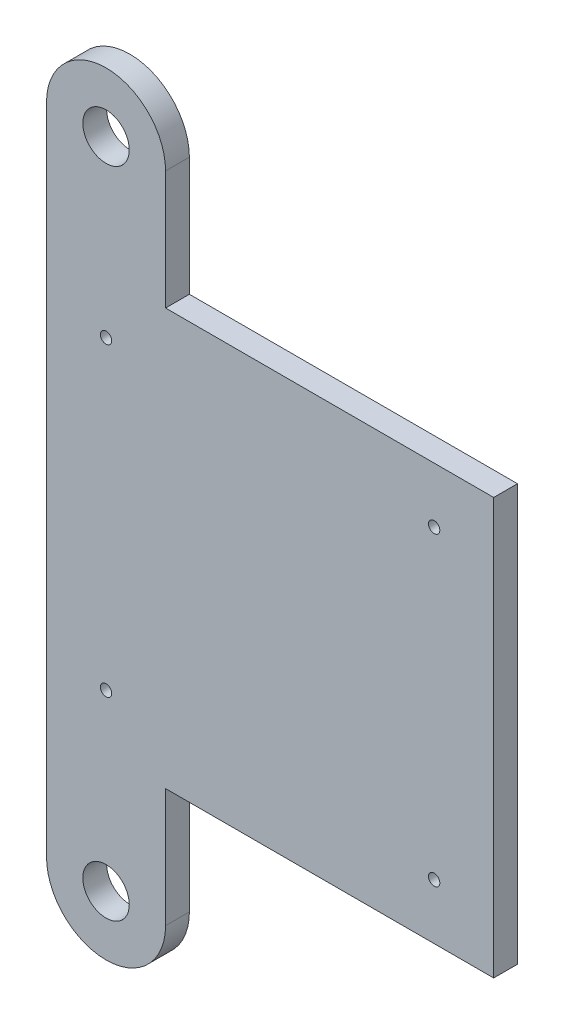
ISO-10303-21;
HEADER;
FILE_DESCRIPTION(('STEP AP214'),'2;1');
FILE_NAME('part.step','',(''),(''),'','','');
FILE_SCHEMA(('AUTOMOTIVE_DESIGN { 1 0 10303 214 1 1 1 1 }'));
ENDSEC;
DATA;
#1=APPLICATION_CONTEXT('core data for automotive mechanical design processes');
#2=APPLICATION_PROTOCOL_DEFINITION('international standard','automotive_design',2000,#1);
#3=PRODUCT_CONTEXT('',#1,'mechanical');
#4=PRODUCT('Part','Part','',(#3));
#5=PRODUCT_RELATED_PRODUCT_CATEGORY('part','',(#4));
#6=PRODUCT_DEFINITION_FORMATION('','',#4);
#7=PRODUCT_DEFINITION_CONTEXT('part definition',#1,'design');
#8=PRODUCT_DEFINITION('design','',#6,#7);
#9=PRODUCT_DEFINITION_SHAPE('','',#8);
#10=(LENGTH_UNIT() NAMED_UNIT(*) SI_UNIT(.MILLI.,.METRE.));
#11=(NAMED_UNIT(*) PLANE_ANGLE_UNIT() SI_UNIT($,.RADIAN.));
#12=(NAMED_UNIT(*) SI_UNIT($,.STERADIAN.) SOLID_ANGLE_UNIT());
#13=UNCERTAINTY_MEASURE_WITH_UNIT(LENGTH_MEASURE(1.E-05),#10,'distance_accuracy_value','');
#14=(GEOMETRIC_REPRESENTATION_CONTEXT(3) GLOBAL_UNCERTAINTY_ASSIGNED_CONTEXT((#13)) GLOBAL_UNIT_ASSIGNED_CONTEXT((#10,
#11,#12)) REPRESENTATION_CONTEXT('',''));
#15=CARTESIAN_POINT('',(0.,0.,0.));
#16=DIRECTION('',(0.,0.,1.));
#17=DIRECTION('',(1.,0.,0.));
#18=AXIS2_PLACEMENT_3D('',#15,#16,#17);
#19=CARTESIAN_POINT('',(0.,17.4784833091437,2.));
#20=DIRECTION('',(0.,1.,0.));
#21=DIRECTION('',(-1.,0.,0.));
#22=AXIS2_PLACEMENT_3D('',#19,#20,#21);
#23=PLANE('',#22);
#24=DIRECTION('',(1.,0.,0.));
#25=VECTOR('',#24,1.);
#26=CARTESIAN_POINT('',(0.,17.4784833091437,0.));
#27=LINE('',#26,#25);
#28=CARTESIAN_POINT('',(-8.77999999999999,17.4784833091437,0.));
#29=VERTEX_POINT('',#28);
#30=CARTESIAN_POINT('',(18.78,17.4784833091437,0.));
#31=VERTEX_POINT('',#30);
#32=EDGE_CURVE('E140',#29,#31,#27,.T.);
#33=ORIENTED_EDGE('',*,*,#32,.F.);
#34=DIRECTION('',(0.,0.,-1.));
#35=VECTOR('',#34,1.);
#36=CARTESIAN_POINT('',(-8.77999999999999,17.4784833091437,2.));
#37=LINE('',#36,#35);
#38=CARTESIAN_POINT('',(-8.77999999999999,17.4784833091437,2.));
#39=VERTEX_POINT('',#38);
#40=EDGE_CURVE('E11',#39,#29,#37,.T.);
#41=ORIENTED_EDGE('',*,*,#40,.F.);
#42=DIRECTION('',(1.,0.,0.));
#43=VECTOR('',#42,1.);
#44=CARTESIAN_POINT('',(0.,17.4784833091437,2.));
#45=LINE('',#44,#43);
#46=CARTESIAN_POINT('',(18.78,17.4784833091437,2.));
#47=VERTEX_POINT('',#46);
#48=EDGE_CURVE('E166',#39,#47,#45,.T.);
#49=ORIENTED_EDGE('',*,*,#48,.T.);
#50=DIRECTION('',(0.,0.,-1.));
#51=VECTOR('',#50,1.);
#52=CARTESIAN_POINT('',(18.78,17.4784833091437,2.));
#53=LINE('',#52,#51);
#54=EDGE_CURVE('E93',#47,#31,#53,.T.);
#55=ORIENTED_EDGE('',*,*,#54,.T.);
#56=EDGE_LOOP('',(#33,#41,#49,#55));
#57=FACE_BOUND('',#56,.T.);
#58=ADVANCED_FACE('F41',(#57),#23,.T.);
#59=CARTESIAN_POINT('',(-8.77999999999999,0.,2.));
#60=DIRECTION('',(-1.,0.,0.));
#61=DIRECTION('',(0.,-1.,0.));
#62=AXIS2_PLACEMENT_3D('',#59,#60,#61);
#63=PLANE('',#62);
#64=DIRECTION('',(0.,1.,0.));
#65=VECTOR('',#64,1.);
#66=CARTESIAN_POINT('',(-8.77999999999999,0.,0.));
#67=LINE('',#66,#65);
#68=CARTESIAN_POINT('',(-8.77999999999999,27.45,0.));
#69=VERTEX_POINT('',#68);
#70=EDGE_CURVE('E144',#29,#69,#67,.T.);
#71=ORIENTED_EDGE('',*,*,#70,.T.);
#72=DIRECTION('',(0.,0.,-1.));
#73=VECTOR('',#72,1.);
#74=CARTESIAN_POINT('',(-8.77999999999999,27.45,2.));
#75=LINE('',#74,#73);
#76=CARTESIAN_POINT('',(-8.77999999999999,27.45,2.));
#77=VERTEX_POINT('',#76);
#78=EDGE_CURVE('E50',#77,#69,#75,.T.);
#79=ORIENTED_EDGE('',*,*,#78,.F.);
#80=DIRECTION('',(0.,1.,0.));
#81=VECTOR('',#80,1.);
#82=CARTESIAN_POINT('',(-8.77999999999999,0.,2.));
#83=LINE('',#82,#81);
#84=EDGE_CURVE('E201',#39,#77,#83,.T.);
#85=ORIENTED_EDGE('',*,*,#84,.F.);
#86=ORIENTED_EDGE('',*,*,#40,.T.);
#87=EDGE_LOOP('',(#71,#79,#85,#86));
#88=FACE_BOUND('',#87,.T.);
#89=ADVANCED_FACE('F288',(#88),#63,.F.);
#90=CARTESIAN_POINT('',(-13.78,27.45,2.));
#91=DIRECTION('',(0.,0.,-1.));
#92=DIRECTION('',(-1.,0.,0.));
#93=AXIS2_PLACEMENT_3D('',#90,#91,#92);
#94=CYLINDRICAL_SURFACE('',#93,5.00000000000001);
#95=CARTESIAN_POINT('',(-13.78,27.45,0.));
#96=DIRECTION('',(0.,0.,1.));
#97=DIRECTION('',(1.,0.,0.));
#98=AXIS2_PLACEMENT_3D('',#95,#96,#97);
#99=CIRCLE('',#98,5.00000000000001);
#100=CARTESIAN_POINT('',(-18.78,27.45,0.));
#101=VERTEX_POINT('',#100);
#102=EDGE_CURVE('E148',#69,#101,#99,.T.);
#103=ORIENTED_EDGE('',*,*,#102,.T.);
#104=DIRECTION('',(0.,0.,-1.));
#105=VECTOR('',#104,1.);
#106=CARTESIAN_POINT('',(-18.78,27.45,2.));
#107=LINE('',#106,#105);
#108=CARTESIAN_POINT('',(-18.78,27.45,2.));
#109=VERTEX_POINT('',#108);
#110=EDGE_CURVE('E176',#109,#101,#107,.T.);
#111=ORIENTED_EDGE('',*,*,#110,.F.);
#112=CARTESIAN_POINT('',(-13.78,27.45,2.));
#113=DIRECTION('',(0.,0.,1.));
#114=DIRECTION('',(1.,0.,0.));
#115=AXIS2_PLACEMENT_3D('',#112,#113,#114);
#116=CIRCLE('',#115,5.00000000000001);
#117=EDGE_CURVE('E186',#77,#109,#116,.T.);
#118=ORIENTED_EDGE('',*,*,#117,.F.);
#119=ORIENTED_EDGE('',*,*,#78,.T.);
#120=EDGE_LOOP('',(#103,#111,#118,#119));
#121=FACE_BOUND('',#120,.T.);
#122=ADVANCED_FACE('F184',(#121),#94,.T.);
#123=CARTESIAN_POINT('',(-18.78,0.,2.));
#124=DIRECTION('',(-1.,0.,0.));
#125=DIRECTION('',(0.,0.,1.));
#126=AXIS2_PLACEMENT_3D('',#123,#124,#125);
#127=PLANE('',#126);
#128=DIRECTION('',(0.,1.,0.));
#129=VECTOR('',#128,1.);
#130=CARTESIAN_POINT('',(-18.78,0.,0.));
#131=LINE('',#130,#129);
#132=CARTESIAN_POINT('',(-18.78,-27.45,0.));
#133=VERTEX_POINT('',#132);
#134=EDGE_CURVE('E152',#133,#101,#131,.T.);
#135=ORIENTED_EDGE('',*,*,#134,.F.);
#136=DIRECTION('',(0.,0.,-1.));
#137=VECTOR('',#136,1.);
#138=CARTESIAN_POINT('',(-18.78,-27.45,2.));
#139=LINE('',#138,#137);
#140=CARTESIAN_POINT('',(-18.78,-27.45,2.));
#141=VERTEX_POINT('',#140);
#142=EDGE_CURVE('E173',#141,#133,#139,.T.);
#143=ORIENTED_EDGE('',*,*,#142,.F.);
#144=DIRECTION('',(0.,1.,0.));
#145=VECTOR('',#144,1.);
#146=CARTESIAN_POINT('',(-18.78,0.,2.));
#147=LINE('',#146,#145);
#148=EDGE_CURVE('E196',#141,#109,#147,.T.);
#149=ORIENTED_EDGE('',*,*,#148,.T.);
#150=ORIENTED_EDGE('',*,*,#110,.T.);
#151=EDGE_LOOP('',(#135,#143,#149,#150));
#152=FACE_BOUND('',#151,.T.);
#153=ADVANCED_FACE('F194',(#152),#127,.T.);
#154=CARTESIAN_POINT('',(-13.78,-27.45,2.));
#155=DIRECTION('',(0.,0.,-1.));
#156=DIRECTION('',(-1.,0.,0.));
#157=AXIS2_PLACEMENT_3D('',#154,#155,#156);
#158=CYLINDRICAL_SURFACE('',#157,5.00000000000001);
#159=CARTESIAN_POINT('',(-13.78,-27.45,0.));
#160=DIRECTION('',(0.,0.,1.));
#161=DIRECTION('',(1.,0.,0.));
#162=AXIS2_PLACEMENT_3D('',#159,#160,#161);
#163=CIRCLE('',#162,5.00000000000001);
#164=CARTESIAN_POINT('',(-8.77999999999999,-27.45,0.));
#165=VERTEX_POINT('',#164);
#166=EDGE_CURVE('E156',#133,#165,#163,.T.);
#167=ORIENTED_EDGE('',*,*,#166,.T.);
#168=DIRECTION('',(0.,0.,-1.));
#169=VECTOR('',#168,1.);
#170=CARTESIAN_POINT('',(-8.77999999999999,-27.45,2.));
#171=LINE('',#170,#169);
#172=CARTESIAN_POINT('',(-8.77999999999999,-27.45,2.));
#173=VERTEX_POINT('',#172);
#174=EDGE_CURVE('E130',#173,#165,#171,.T.);
#175=ORIENTED_EDGE('',*,*,#174,.F.);
#176=CARTESIAN_POINT('',(-13.78,-27.45,2.));
#177=DIRECTION('',(0.,0.,1.));
#178=DIRECTION('',(1.,0.,0.));
#179=AXIS2_PLACEMENT_3D('',#176,#177,#178);
#180=CIRCLE('',#179,5.00000000000001);
#181=EDGE_CURVE('E119',#141,#173,#180,.T.);
#182=ORIENTED_EDGE('',*,*,#181,.F.);
#183=ORIENTED_EDGE('',*,*,#142,.T.);
#184=EDGE_LOOP('',(#167,#175,#182,#183));
#185=FACE_BOUND('',#184,.T.);
#186=ADVANCED_FACE('F303',(#185),#158,.T.);
#187=CARTESIAN_POINT('',(-8.77999999999999,0.,2.));
#188=DIRECTION('',(-1.,0.,0.));
#189=DIRECTION('',(0.,-1.,0.));
#190=AXIS2_PLACEMENT_3D('',#187,#188,#189);
#191=PLANE('',#190);
#192=DIRECTION('',(0.,1.,0.));
#193=VECTOR('',#192,1.);
#194=CARTESIAN_POINT('',(-8.77999999999999,0.,0.));
#195=LINE('',#194,#193);
#196=CARTESIAN_POINT('',(-8.77999999999999,-17.4784833091437,0.));
#197=VERTEX_POINT('',#196);
#198=EDGE_CURVE('E128',#165,#197,#195,.T.);
#199=ORIENTED_EDGE('',*,*,#198,.T.);
#200=DIRECTION('',(0.,0.,-1.));
#201=VECTOR('',#200,1.);
#202=CARTESIAN_POINT('',(-8.77999999999999,-17.4784833091437,2.));
#203=LINE('',#202,#201);
#204=CARTESIAN_POINT('',(-8.77999999999999,-17.4784833091437,2.));
#205=VERTEX_POINT('',#204);
#206=EDGE_CURVE('E125',#205,#197,#203,.T.);
#207=ORIENTED_EDGE('',*,*,#206,.F.);
#208=DIRECTION('',(0.,1.,0.));
#209=VECTOR('',#208,1.);
#210=CARTESIAN_POINT('',(-8.77999999999999,0.,2.));
#211=LINE('',#210,#209);
#212=EDGE_CURVE('E112',#173,#205,#211,.T.);
#213=ORIENTED_EDGE('',*,*,#212,.F.);
#214=ORIENTED_EDGE('',*,*,#174,.T.);
#215=EDGE_LOOP('',(#199,#207,#213,#214));
#216=FACE_BOUND('',#215,.T.);
#217=ADVANCED_FACE('F126',(#216),#191,.F.);
#218=CARTESIAN_POINT('',(0.,-17.4784833091437,2.));
#219=DIRECTION('',(0.,1.,0.));
#220=DIRECTION('',(-1.,0.,0.));
#221=AXIS2_PLACEMENT_3D('',#218,#219,#220);
#222=PLANE('',#221);
#223=DIRECTION('',(1.,0.,0.));
#224=VECTOR('',#223,1.);
#225=CARTESIAN_POINT('',(0.,-17.4784833091437,0.));
#226=LINE('',#225,#224);
#227=CARTESIAN_POINT('',(18.78,-17.4784833091437,0.));
#228=VERTEX_POINT('',#227);
#229=EDGE_CURVE('E86',#197,#228,#226,.T.);
#230=ORIENTED_EDGE('',*,*,#229,.T.);
#231=DIRECTION('',(0.,0.,-1.));
#232=VECTOR('',#231,1.);
#233=CARTESIAN_POINT('',(18.78,-17.4784833091437,2.));
#234=LINE('',#233,#232);
#235=CARTESIAN_POINT('',(18.78,-17.4784833091437,2.));
#236=VERTEX_POINT('',#235);
#237=EDGE_CURVE('E131',#236,#228,#234,.T.);
#238=ORIENTED_EDGE('',*,*,#237,.F.);
#239=DIRECTION('',(1.,0.,0.));
#240=VECTOR('',#239,1.);
#241=CARTESIAN_POINT('',(0.,-17.4784833091437,2.));
#242=LINE('',#241,#240);
#243=EDGE_CURVE('E116',#205,#236,#242,.T.);
#244=ORIENTED_EDGE('',*,*,#243,.F.);
#245=ORIENTED_EDGE('',*,*,#206,.T.);
#246=EDGE_LOOP('',(#230,#238,#244,#245));
#247=FACE_BOUND('',#246,.T.);
#248=ADVANCED_FACE('F133',(#247),#222,.F.);
#249=CARTESIAN_POINT('',(18.78,0.,2.));
#250=DIRECTION('',(-1.,0.,0.));
#251=DIRECTION('',(0.,-1.,0.));
#252=AXIS2_PLACEMENT_3D('',#249,#250,#251);
#253=PLANE('',#252);
#254=DIRECTION('',(0.,1.,0.));
#255=VECTOR('',#254,1.);
#256=CARTESIAN_POINT('',(18.78,0.,0.));
#257=LINE('',#256,#255);
#258=EDGE_CURVE('E163',#228,#31,#257,.T.);
#259=ORIENTED_EDGE('',*,*,#258,.T.);
#260=ORIENTED_EDGE('',*,*,#54,.F.);
#261=DIRECTION('',(0.,1.,0.));
#262=VECTOR('',#261,1.);
#263=CARTESIAN_POINT('',(18.78,0.,2.));
#264=LINE('',#263,#262);
#265=EDGE_CURVE('E58',#236,#47,#264,.T.);
#266=ORIENTED_EDGE('',*,*,#265,.F.);
#267=ORIENTED_EDGE('',*,*,#237,.T.);
#268=EDGE_LOOP('',(#259,#260,#266,#267));
#269=FACE_BOUND('',#268,.T.);
#270=ADVANCED_FACE('F260',(#269),#253,.F.);
#271=CARTESIAN_POINT('',(0.,0.,2.));
#272=DIRECTION('',(0.,0.,1.));
#273=DIRECTION('',(1.,0.,0.));
#274=AXIS2_PLACEMENT_3D('',#271,#272,#273);
#275=PLANE('',#274);
#276=CARTESIAN_POINT('',(-13.78,-27.45,2.));
#277=DIRECTION('',(0.,0.,1.));
#278=DIRECTION('',(1.,0.,0.));
#279=AXIS2_PLACEMENT_3D('',#276,#277,#278);
#280=CIRCLE('',#279,1.95);
#281=CARTESIAN_POINT('',(-11.83,-27.45,2.));
#282=VERTEX_POINT('',#281);
#283=EDGE_CURVE('E251',#282,#282,#280,.T.);
#284=ORIENTED_EDGE('',*,*,#283,.F.);
#285=EDGE_LOOP('',(#284));
#286=FACE_BOUND('',#285,.T.);
#287=CARTESIAN_POINT('',(-13.78,27.45,2.));
#288=DIRECTION('',(0.,0.,1.));
#289=DIRECTION('',(1.,0.,0.));
#290=AXIS2_PLACEMENT_3D('',#287,#288,#289);
#291=CIRCLE('',#290,1.95);
#292=CARTESIAN_POINT('',(-11.83,27.45,2.));
#293=VERTEX_POINT('',#292);
#294=EDGE_CURVE('E243',#293,#293,#291,.T.);
#295=ORIENTED_EDGE('',*,*,#294,.F.);
#296=EDGE_LOOP('',(#295));
#297=FACE_BOUND('',#296,.T.);
#298=CARTESIAN_POINT('',(-13.78,-12.825,2.));
#299=DIRECTION('',(0.,0.,1.));
#300=DIRECTION('',(1.,0.,0.));
#301=AXIS2_PLACEMENT_3D('',#298,#299,#300);
#302=CIRCLE('',#301,0.474999999999988);
#303=CARTESIAN_POINT('',(-13.305,-12.825,2.));
#304=VERTEX_POINT('',#303);
#305=EDGE_CURVE('E235',#304,#304,#302,.T.);
#306=ORIENTED_EDGE('',*,*,#305,.F.);
#307=EDGE_LOOP('',(#306));
#308=FACE_BOUND('',#307,.T.);
#309=CARTESIAN_POINT('',(-13.78,12.825,2.));
#310=DIRECTION('',(0.,0.,1.));
#311=DIRECTION('',(1.,0.,0.));
#312=AXIS2_PLACEMENT_3D('',#309,#310,#311);
#313=CIRCLE('',#312,0.474999999999988);
#314=CARTESIAN_POINT('',(-13.305,12.825,2.));
#315=VERTEX_POINT('',#314);
#316=EDGE_CURVE('E227',#315,#315,#313,.T.);
#317=ORIENTED_EDGE('',*,*,#316,.F.);
#318=EDGE_LOOP('',(#317));
#319=FACE_BOUND('',#318,.T.);
#320=CARTESIAN_POINT('',(13.78,12.825,2.));
#321=DIRECTION('',(0.,0.,1.));
#322=DIRECTION('',(1.,0.,0.));
#323=AXIS2_PLACEMENT_3D('',#320,#321,#322);
#324=CIRCLE('',#323,0.474999999999988);
#325=CARTESIAN_POINT('',(14.255,12.825,2.));
#326=VERTEX_POINT('',#325);
#327=EDGE_CURVE('E219',#326,#326,#324,.T.);
#328=ORIENTED_EDGE('',*,*,#327,.F.);
#329=EDGE_LOOP('',(#328));
#330=FACE_BOUND('',#329,.T.);
#331=CARTESIAN_POINT('',(13.78,-12.825,2.));
#332=DIRECTION('',(0.,0.,1.));
#333=DIRECTION('',(1.,0.,0.));
#334=AXIS2_PLACEMENT_3D('',#331,#332,#333);
#335=CIRCLE('',#334,0.474999999999988);
#336=CARTESIAN_POINT('',(14.255,-12.825,2.));
#337=VERTEX_POINT('',#336);
#338=EDGE_CURVE('E211',#337,#337,#335,.T.);
#339=ORIENTED_EDGE('',*,*,#338,.F.);
#340=EDGE_LOOP('',(#339));
#341=FACE_BOUND('',#340,.T.);
#342=ORIENTED_EDGE('',*,*,#48,.F.);
#343=ORIENTED_EDGE('',*,*,#84,.T.);
#344=ORIENTED_EDGE('',*,*,#117,.T.);
#345=ORIENTED_EDGE('',*,*,#148,.F.);
#346=ORIENTED_EDGE('',*,*,#181,.T.);
#347=ORIENTED_EDGE('',*,*,#212,.T.);
#348=ORIENTED_EDGE('',*,*,#243,.T.);
#349=ORIENTED_EDGE('',*,*,#265,.T.);
#350=EDGE_LOOP('',(#342,#343,#344,#345,#346,#347,#348,#349));
#351=FACE_BOUND('',#350,.T.);
#352=ADVANCED_FACE('F114',(#286,#297,#308,#319,#330,#341,#351),#275,.T.);
#353=CARTESIAN_POINT('',(0.,0.,0.));
#354=DIRECTION('',(0.,0.,1.));
#355=DIRECTION('',(1.,0.,0.));
#356=AXIS2_PLACEMENT_3D('',#353,#354,#355);
#357=PLANE('',#356);
#358=CARTESIAN_POINT('',(-13.78,-27.45,0.));
#359=DIRECTION('',(0.,0.,1.));
#360=DIRECTION('',(1.,0.,0.));
#361=AXIS2_PLACEMENT_3D('',#358,#359,#360);
#362=CIRCLE('',#361,1.95);
#363=CARTESIAN_POINT('',(-11.83,-27.45,0.));
#364=VERTEX_POINT('',#363);
#365=EDGE_CURVE('E247',#364,#364,#362,.T.);
#366=ORIENTED_EDGE('',*,*,#365,.T.);
#367=EDGE_LOOP('',(#366));
#368=FACE_BOUND('',#367,.T.);
#369=CARTESIAN_POINT('',(-13.78,27.45,0.));
#370=DIRECTION('',(0.,0.,1.));
#371=DIRECTION('',(1.,0.,0.));
#372=AXIS2_PLACEMENT_3D('',#369,#370,#371);
#373=CIRCLE('',#372,1.95);
#374=CARTESIAN_POINT('',(-11.83,27.45,0.));
#375=VERTEX_POINT('',#374);
#376=EDGE_CURVE('E239',#375,#375,#373,.T.);
#377=ORIENTED_EDGE('',*,*,#376,.T.);
#378=EDGE_LOOP('',(#377));
#379=FACE_BOUND('',#378,.T.);
#380=CARTESIAN_POINT('',(-13.78,-12.825,0.));
#381=DIRECTION('',(0.,0.,1.));
#382=DIRECTION('',(1.,0.,0.));
#383=AXIS2_PLACEMENT_3D('',#380,#381,#382);
#384=CIRCLE('',#383,0.474999999999994);
#385=CARTESIAN_POINT('',(-13.305,-12.825,0.));
#386=VERTEX_POINT('',#385);
#387=EDGE_CURVE('E231',#386,#386,#384,.T.);
#388=ORIENTED_EDGE('',*,*,#387,.T.);
#389=EDGE_LOOP('',(#388));
#390=FACE_BOUND('',#389,.T.);
#391=CARTESIAN_POINT('',(-13.78,12.825,0.));
#392=DIRECTION('',(0.,0.,1.));
#393=DIRECTION('',(1.,0.,0.));
#394=AXIS2_PLACEMENT_3D('',#391,#392,#393);
#395=CIRCLE('',#394,0.474999999999994);
#396=CARTESIAN_POINT('',(-13.305,12.825,0.));
#397=VERTEX_POINT('',#396);
#398=EDGE_CURVE('E223',#397,#397,#395,.T.);
#399=ORIENTED_EDGE('',*,*,#398,.T.);
#400=EDGE_LOOP('',(#399));
#401=FACE_BOUND('',#400,.T.);
#402=CARTESIAN_POINT('',(13.78,12.825,0.));
#403=DIRECTION('',(0.,0.,1.));
#404=DIRECTION('',(1.,0.,0.));
#405=AXIS2_PLACEMENT_3D('',#402,#403,#404);
#406=CIRCLE('',#405,0.474999999999994);
#407=CARTESIAN_POINT('',(14.255,12.825,0.));
#408=VERTEX_POINT('',#407);
#409=EDGE_CURVE('E215',#408,#408,#406,.T.);
#410=ORIENTED_EDGE('',*,*,#409,.T.);
#411=EDGE_LOOP('',(#410));
#412=FACE_BOUND('',#411,.T.);
#413=CARTESIAN_POINT('',(13.78,-12.825,0.));
#414=DIRECTION('',(0.,0.,1.));
#415=DIRECTION('',(1.,0.,0.));
#416=AXIS2_PLACEMENT_3D('',#413,#414,#415);
#417=CIRCLE('',#416,0.474999999999994);
#418=CARTESIAN_POINT('',(14.255,-12.825,0.));
#419=VERTEX_POINT('',#418);
#420=EDGE_CURVE('E145',#419,#419,#417,.T.);
#421=ORIENTED_EDGE('',*,*,#420,.T.);
#422=EDGE_LOOP('',(#421));
#423=FACE_BOUND('',#422,.T.);
#424=ORIENTED_EDGE('',*,*,#32,.T.);
#425=ORIENTED_EDGE('',*,*,#258,.F.);
#426=ORIENTED_EDGE('',*,*,#229,.F.);
#427=ORIENTED_EDGE('',*,*,#198,.F.);
#428=ORIENTED_EDGE('',*,*,#166,.F.);
#429=ORIENTED_EDGE('',*,*,#134,.T.);
#430=ORIENTED_EDGE('',*,*,#102,.F.);
#431=ORIENTED_EDGE('',*,*,#70,.F.);
#432=EDGE_LOOP('',(#424,#425,#426,#427,#428,#429,#430,#431));
#433=FACE_BOUND('',#432,.T.);
#434=ADVANCED_FACE('F190',(#368,#379,#390,#401,#412,#423,#433),#357,.F.);
#435=CARTESIAN_POINT('',(13.78,-12.825,2.));
#436=DIRECTION('',(0.,0.,1.));
#437=DIRECTION('',(1.,0.,0.));
#438=AXIS2_PLACEMENT_3D('',#435,#436,#437);
#439=CYLINDRICAL_SURFACE('',#438,0.474999999999994);
#440=ORIENTED_EDGE('',*,*,#420,.F.);
#441=EDGE_LOOP('',(#440));
#442=FACE_BOUND('',#441,.T.);
#443=ORIENTED_EDGE('',*,*,#338,.T.);
#444=EDGE_LOOP('',(#443));
#445=FACE_BOUND('',#444,.T.);
#446=ADVANCED_FACE('F272',(#442,#445),#439,.F.);
#447=CARTESIAN_POINT('',(13.78,12.825,2.));
#448=DIRECTION('',(0.,0.,1.));
#449=DIRECTION('',(1.,0.,0.));
#450=AXIS2_PLACEMENT_3D('',#447,#448,#449);
#451=CYLINDRICAL_SURFACE('',#450,0.474999999999994);
#452=ORIENTED_EDGE('',*,*,#409,.F.);
#453=EDGE_LOOP('',(#452));
#454=FACE_BOUND('',#453,.T.);
#455=ORIENTED_EDGE('',*,*,#327,.T.);
#456=EDGE_LOOP('',(#455));
#457=FACE_BOUND('',#456,.T.);
#458=ADVANCED_FACE('F274',(#454,#457),#451,.F.);
#459=CARTESIAN_POINT('',(-13.78,12.825,2.));
#460=DIRECTION('',(0.,0.,1.));
#461=DIRECTION('',(1.,0.,0.));
#462=AXIS2_PLACEMENT_3D('',#459,#460,#461);
#463=CYLINDRICAL_SURFACE('',#462,0.474999999999994);
#464=ORIENTED_EDGE('',*,*,#398,.F.);
#465=EDGE_LOOP('',(#464));
#466=FACE_BOUND('',#465,.T.);
#467=ORIENTED_EDGE('',*,*,#316,.T.);
#468=EDGE_LOOP('',(#467));
#469=FACE_BOUND('',#468,.T.);
#470=ADVANCED_FACE('F281',(#466,#469),#463,.F.);
#471=CARTESIAN_POINT('',(-13.78,-12.825,2.));
#472=DIRECTION('',(0.,0.,1.));
#473=DIRECTION('',(1.,0.,0.));
#474=AXIS2_PLACEMENT_3D('',#471,#472,#473);
#475=CYLINDRICAL_SURFACE('',#474,0.474999999999994);
#476=ORIENTED_EDGE('',*,*,#387,.F.);
#477=EDGE_LOOP('',(#476));
#478=FACE_BOUND('',#477,.T.);
#479=ORIENTED_EDGE('',*,*,#305,.T.);
#480=EDGE_LOOP('',(#479));
#481=FACE_BOUND('',#480,.T.);
#482=ADVANCED_FACE('F355',(#478,#481),#475,.F.);
#483=CARTESIAN_POINT('',(-13.78,27.45,2.));
#484=DIRECTION('',(0.,0.,1.));
#485=DIRECTION('',(1.,0.,0.));
#486=AXIS2_PLACEMENT_3D('',#483,#484,#485);
#487=CYLINDRICAL_SURFACE('',#486,1.95);
#488=ORIENTED_EDGE('',*,*,#376,.F.);
#489=EDGE_LOOP('',(#488));
#490=FACE_BOUND('',#489,.T.);
#491=ORIENTED_EDGE('',*,*,#294,.T.);
#492=EDGE_LOOP('',(#491));
#493=FACE_BOUND('',#492,.T.);
#494=ADVANCED_FACE('F365',(#490,#493),#487,.F.);
#495=CARTESIAN_POINT('',(-13.78,-27.45,2.));
#496=DIRECTION('',(0.,0.,1.));
#497=DIRECTION('',(1.,0.,0.));
#498=AXIS2_PLACEMENT_3D('',#495,#496,#497);
#499=CYLINDRICAL_SURFACE('',#498,1.95);
#500=ORIENTED_EDGE('',*,*,#365,.F.);
#501=EDGE_LOOP('',(#500));
#502=FACE_BOUND('',#501,.T.);
#503=ORIENTED_EDGE('',*,*,#283,.T.);
#504=EDGE_LOOP('',(#503));
#505=FACE_BOUND('',#504,.T.);
#506=ADVANCED_FACE('F256',(#502,#505),#499,.F.);
#507=CLOSED_SHELL('',(#58,#89,#122,#153,#186,#217,#248,#270,#352,#434,#446,#458,#470,#482,#494,#506));
#508=MANIFOLD_SOLID_BREP('B2',#507);
#509=ADVANCED_BREP_SHAPE_REPRESENTATION('',(#18,#508),#14);
#510=SHAPE_DEFINITION_REPRESENTATION(#9,#509);
ENDSEC;
END-ISO-10303-21;
